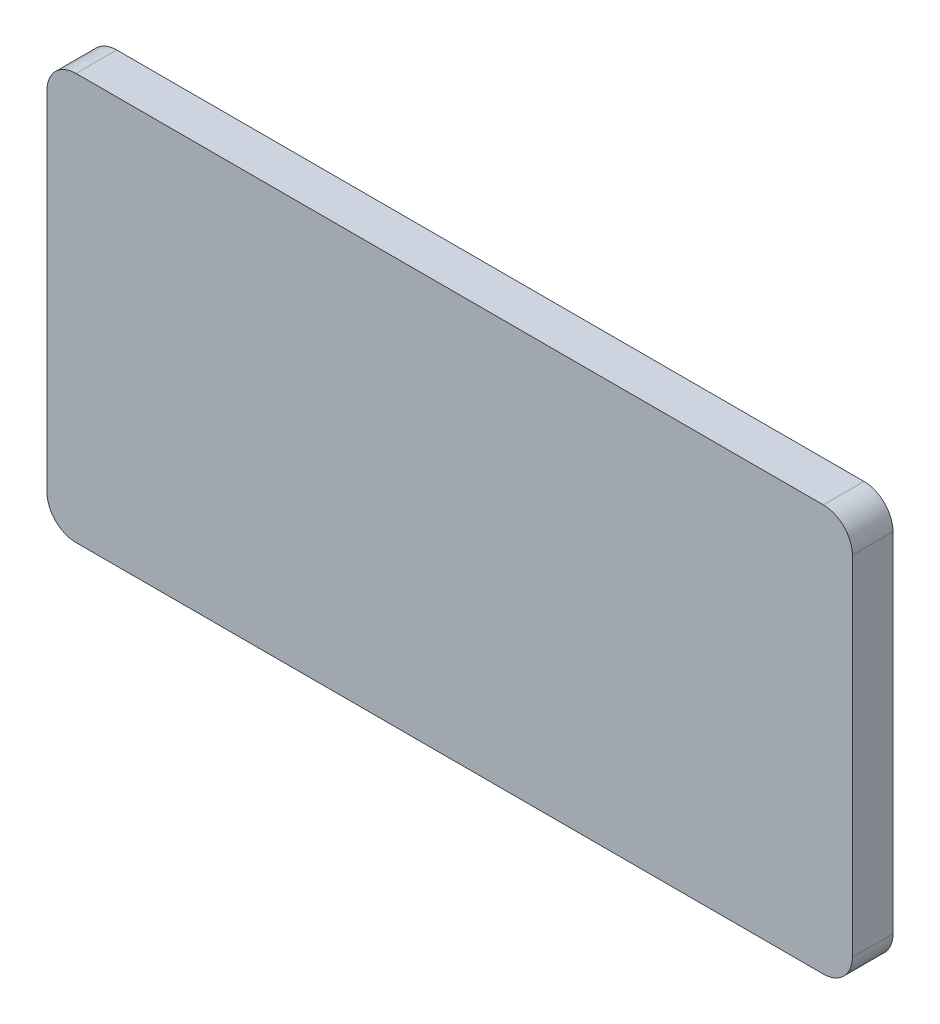
ISO-10303-21;
HEADER;
FILE_DESCRIPTION(('STEP AP214'),'2;1');
FILE_NAME('part.step','',(''),(''),'','','');
FILE_SCHEMA(('AUTOMOTIVE_DESIGN { 1 0 10303 214 1 1 1 1 }'));
ENDSEC;
DATA;
#1=APPLICATION_CONTEXT('core data for automotive mechanical design processes');
#2=APPLICATION_PROTOCOL_DEFINITION('international standard','automotive_design',2000,#1);
#3=PRODUCT_CONTEXT('',#1,'mechanical');
#4=PRODUCT('Part','Part','',(#3));
#5=PRODUCT_RELATED_PRODUCT_CATEGORY('part','',(#4));
#6=PRODUCT_DEFINITION_FORMATION('','',#4);
#7=PRODUCT_DEFINITION_CONTEXT('part definition',#1,'design');
#8=PRODUCT_DEFINITION('design','',#6,#7);
#9=PRODUCT_DEFINITION_SHAPE('','',#8);
#10=(LENGTH_UNIT() NAMED_UNIT(*) SI_UNIT(.MILLI.,.METRE.));
#11=(NAMED_UNIT(*) PLANE_ANGLE_UNIT() SI_UNIT($,.RADIAN.));
#12=(NAMED_UNIT(*) SI_UNIT($,.STERADIAN.) SOLID_ANGLE_UNIT());
#13=UNCERTAINTY_MEASURE_WITH_UNIT(LENGTH_MEASURE(1.E-05),#10,'distance_accuracy_value','');
#14=(GEOMETRIC_REPRESENTATION_CONTEXT(3) GLOBAL_UNCERTAINTY_ASSIGNED_CONTEXT((#13)) GLOBAL_UNIT_ASSIGNED_CONTEXT((#10,
#11,#12)) REPRESENTATION_CONTEXT('',''));
#15=CARTESIAN_POINT('',(0.,0.,0.));
#16=DIRECTION('',(0.,0.,1.));
#17=DIRECTION('',(1.,0.,0.));
#18=AXIS2_PLACEMENT_3D('',#15,#16,#17);
#19=CARTESIAN_POINT('',(-65.6231454005935,-30.,7.));
#20=DIRECTION('',(0.,0.,-1.));
#21=DIRECTION('',(-1.,0.,0.));
#22=AXIS2_PLACEMENT_3D('',#19,#20,#21);
#23=CYLINDRICAL_SURFACE('',#22,5.);
#24=CARTESIAN_POINT('',(-65.6231454005935,-30.,0.));
#25=DIRECTION('',(0.,0.,1.));
#26=DIRECTION('',(1.,0.,0.));
#27=AXIS2_PLACEMENT_3D('',#24,#25,#26);
#28=CIRCLE('',#27,5.);
#29=CARTESIAN_POINT('',(-70.6231454005935,-30.,0.));
#30=VERTEX_POINT('',#29);
#31=CARTESIAN_POINT('',(-65.6231454005935,-35.,0.));
#32=VERTEX_POINT('',#31);
#33=EDGE_CURVE('E133',#30,#32,#28,.T.);
#34=ORIENTED_EDGE('',*,*,#33,.T.);
#35=DIRECTION('',(0.,0.,-1.));
#36=VECTOR('',#35,1.);
#37=CARTESIAN_POINT('',(-65.6231454005935,-35.,7.));
#38=LINE('',#37,#36);
#39=CARTESIAN_POINT('',(-65.6231454005935,-35.,7.));
#40=VERTEX_POINT('',#39);
#41=EDGE_CURVE('E11',#40,#32,#38,.T.);
#42=ORIENTED_EDGE('',*,*,#41,.F.);
#43=CARTESIAN_POINT('',(-65.6231454005935,-30.,7.));
#44=DIRECTION('',(0.,0.,1.));
#45=DIRECTION('',(1.,0.,0.));
#46=AXIS2_PLACEMENT_3D('',#43,#44,#45);
#47=CIRCLE('',#46,5.);
#48=CARTESIAN_POINT('',(-70.6231454005935,-30.,7.));
#49=VERTEX_POINT('',#48);
#50=EDGE_CURVE('E147',#49,#40,#47,.T.);
#51=ORIENTED_EDGE('',*,*,#50,.F.);
#52=DIRECTION('',(0.,0.,-1.));
#53=VECTOR('',#52,1.);
#54=CARTESIAN_POINT('',(-70.6231454005935,-30.,7.));
#55=LINE('',#54,#53);
#56=EDGE_CURVE('E129',#49,#30,#55,.T.);
#57=ORIENTED_EDGE('',*,*,#56,.T.);
#58=EDGE_LOOP('',(#34,#42,#51,#57));
#59=FACE_BOUND('',#58,.T.);
#60=ADVANCED_FACE('F37',(#59),#23,.T.);
#61=CARTESIAN_POINT('',(-65.6231454005935,-35.,7.));
#62=DIRECTION('',(0.,1.,0.));
#63=DIRECTION('',(0.,0.,1.));
#64=AXIS2_PLACEMENT_3D('',#61,#62,#63);
#65=PLANE('',#64);
#66=DIRECTION('',(1.,0.,0.));
#67=VECTOR('',#66,1.);
#68=CARTESIAN_POINT('',(-65.6231454005935,-35.,0.));
#69=LINE('',#68,#67);
#70=CARTESIAN_POINT('',(63.1305637982196,-35.,0.));
#71=VERTEX_POINT('',#70);
#72=EDGE_CURVE('E136',#32,#71,#69,.T.);
#73=ORIENTED_EDGE('',*,*,#72,.T.);
#74=DIRECTION('',(0.,0.,-1.));
#75=VECTOR('',#74,1.);
#76=CARTESIAN_POINT('',(63.1305637982196,-35.,7.));
#77=LINE('',#76,#75);
#78=CARTESIAN_POINT('',(63.1305637982196,-35.,7.));
#79=VERTEX_POINT('',#78);
#80=EDGE_CURVE('E45',#79,#71,#77,.T.);
#81=ORIENTED_EDGE('',*,*,#80,.F.);
#82=DIRECTION('',(1.,0.,0.));
#83=VECTOR('',#82,1.);
#84=CARTESIAN_POINT('',(-65.6231454005935,-35.,7.));
#85=LINE('',#84,#83);
#86=EDGE_CURVE('E96',#40,#79,#85,.T.);
#87=ORIENTED_EDGE('',*,*,#86,.F.);
#88=ORIENTED_EDGE('',*,*,#41,.T.);
#89=EDGE_LOOP('',(#73,#81,#87,#88));
#90=FACE_BOUND('',#89,.T.);
#91=ADVANCED_FACE('F182',(#90),#65,.F.);
#92=CARTESIAN_POINT('',(63.1305637982196,-30.,7.));
#93=DIRECTION('',(0.,0.,-1.));
#94=DIRECTION('',(-1.,0.,0.));
#95=AXIS2_PLACEMENT_3D('',#92,#93,#94);
#96=CYLINDRICAL_SURFACE('',#95,5.);
#97=CARTESIAN_POINT('',(63.1305637982196,-30.,0.));
#98=DIRECTION('',(0.,0.,1.));
#99=DIRECTION('',(1.,0.,0.));
#100=AXIS2_PLACEMENT_3D('',#97,#98,#99);
#101=CIRCLE('',#100,5.);
#102=CARTESIAN_POINT('',(68.1305637982196,-30.,0.));
#103=VERTEX_POINT('',#102);
#104=EDGE_CURVE('E138',#71,#103,#101,.T.);
#105=ORIENTED_EDGE('',*,*,#104,.T.);
#106=DIRECTION('',(0.,0.,-1.));
#107=VECTOR('',#106,1.);
#108=CARTESIAN_POINT('',(68.1305637982196,-30.,7.));
#109=LINE('',#108,#107);
#110=CARTESIAN_POINT('',(68.1305637982196,-30.,7.));
#111=VERTEX_POINT('',#110);
#112=EDGE_CURVE('E154',#111,#103,#109,.T.);
#113=ORIENTED_EDGE('',*,*,#112,.F.);
#114=CARTESIAN_POINT('',(63.1305637982196,-30.,7.));
#115=DIRECTION('',(0.,0.,1.));
#116=DIRECTION('',(1.,0.,0.));
#117=AXIS2_PLACEMENT_3D('',#114,#115,#116);
#118=CIRCLE('',#117,5.);
#119=EDGE_CURVE('E162',#79,#111,#118,.T.);
#120=ORIENTED_EDGE('',*,*,#119,.F.);
#121=ORIENTED_EDGE('',*,*,#80,.T.);
#122=EDGE_LOOP('',(#105,#113,#120,#121));
#123=FACE_BOUND('',#122,.T.);
#124=ADVANCED_FACE('F160',(#123),#96,.T.);
#125=CARTESIAN_POINT('',(68.1305637982196,30.,7.));
#126=DIRECTION('',(-1.,0.,0.));
#127=DIRECTION('',(0.,0.,1.));
#128=AXIS2_PLACEMENT_3D('',#125,#126,#127);
#129=PLANE('',#128);
#130=DIRECTION('',(0.,1.,0.));
#131=VECTOR('',#130,1.);
#132=CARTESIAN_POINT('',(68.1305637982196,30.,0.));
#133=LINE('',#132,#131);
#134=CARTESIAN_POINT('',(68.1305637982196,30.,0.));
#135=VERTEX_POINT('',#134);
#136=EDGE_CURVE('E140',#103,#135,#133,.T.);
#137=ORIENTED_EDGE('',*,*,#136,.T.);
#138=DIRECTION('',(0.,0.,-1.));
#139=VECTOR('',#138,1.);
#140=CARTESIAN_POINT('',(68.1305637982196,30.,7.));
#141=LINE('',#140,#139);
#142=CARTESIAN_POINT('',(68.1305637982196,30.,7.));
#143=VERTEX_POINT('',#142);
#144=EDGE_CURVE('E151',#143,#135,#141,.T.);
#145=ORIENTED_EDGE('',*,*,#144,.F.);
#146=DIRECTION('',(0.,1.,0.));
#147=VECTOR('',#146,1.);
#148=CARTESIAN_POINT('',(68.1305637982196,30.,7.));
#149=LINE('',#148,#147);
#150=EDGE_CURVE('E174',#111,#143,#149,.T.);
#151=ORIENTED_EDGE('',*,*,#150,.F.);
#152=ORIENTED_EDGE('',*,*,#112,.T.);
#153=EDGE_LOOP('',(#137,#145,#151,#152));
#154=FACE_BOUND('',#153,.T.);
#155=ADVANCED_FACE('F170',(#154),#129,.F.);
#156=CARTESIAN_POINT('',(63.1305637982196,30.,7.));
#157=DIRECTION('',(0.,0.,-1.));
#158=DIRECTION('',(-1.,0.,0.));
#159=AXIS2_PLACEMENT_3D('',#156,#157,#158);
#160=CYLINDRICAL_SURFACE('',#159,5.);
#161=CARTESIAN_POINT('',(63.1305637982196,30.,0.));
#162=DIRECTION('',(0.,0.,1.));
#163=DIRECTION('',(-1.,0.,0.));
#164=AXIS2_PLACEMENT_3D('',#161,#162,#163);
#165=CIRCLE('',#164,5.);
#166=CARTESIAN_POINT('',(63.1305637982196,35.,0.));
#167=VERTEX_POINT('',#166);
#168=EDGE_CURVE('E142',#135,#167,#165,.T.);
#169=ORIENTED_EDGE('',*,*,#168,.T.);
#170=DIRECTION('',(0.,0.,-1.));
#171=VECTOR('',#170,1.);
#172=CARTESIAN_POINT('',(63.1305637982196,35.,7.));
#173=LINE('',#172,#171);
#174=CARTESIAN_POINT('',(63.1305637982196,35.,7.));
#175=VERTEX_POINT('',#174);
#176=EDGE_CURVE('E124',#175,#167,#173,.T.);
#177=ORIENTED_EDGE('',*,*,#176,.F.);
#178=CARTESIAN_POINT('',(63.1305637982196,30.,7.));
#179=DIRECTION('',(0.,0.,1.));
#180=DIRECTION('',(-1.,0.,0.));
#181=AXIS2_PLACEMENT_3D('',#178,#179,#180);
#182=CIRCLE('',#181,5.);
#183=EDGE_CURVE('E115',#143,#175,#182,.T.);
#184=ORIENTED_EDGE('',*,*,#183,.F.);
#185=ORIENTED_EDGE('',*,*,#144,.T.);
#186=EDGE_LOOP('',(#169,#177,#184,#185));
#187=FACE_BOUND('',#186,.T.);
#188=ADVANCED_FACE('F173',(#187),#160,.T.);
#189=CARTESIAN_POINT('',(-65.6231454005935,35.,7.));
#190=DIRECTION('',(0.,-1.,0.));
#191=DIRECTION('',(0.,0.,-1.));
#192=AXIS2_PLACEMENT_3D('',#189,#190,#191);
#193=PLANE('',#192);
#194=DIRECTION('',(-1.,0.,0.));
#195=VECTOR('',#194,1.);
#196=CARTESIAN_POINT('',(-65.6231454005935,35.,0.));
#197=LINE('',#196,#195);
#198=CARTESIAN_POINT('',(-65.6231454005935,35.,0.));
#199=VERTEX_POINT('',#198);
#200=EDGE_CURVE('E123',#167,#199,#197,.T.);
#201=ORIENTED_EDGE('',*,*,#200,.T.);
#202=DIRECTION('',(0.,0.,-1.));
#203=VECTOR('',#202,1.);
#204=CARTESIAN_POINT('',(-65.6231454005935,35.,7.));
#205=LINE('',#204,#203);
#206=CARTESIAN_POINT('',(-65.6231454005935,35.,7.));
#207=VERTEX_POINT('',#206);
#208=EDGE_CURVE('E120',#207,#199,#205,.T.);
#209=ORIENTED_EDGE('',*,*,#208,.F.);
#210=DIRECTION('',(-1.,0.,0.));
#211=VECTOR('',#210,1.);
#212=CARTESIAN_POINT('',(-65.6231454005935,35.,7.));
#213=LINE('',#212,#211);
#214=EDGE_CURVE('E109',#175,#207,#213,.T.);
#215=ORIENTED_EDGE('',*,*,#214,.F.);
#216=ORIENTED_EDGE('',*,*,#176,.T.);
#217=EDGE_LOOP('',(#201,#209,#215,#216));
#218=FACE_BOUND('',#217,.T.);
#219=ADVANCED_FACE('F121',(#218),#193,.F.);
#220=CARTESIAN_POINT('',(-65.6231454005935,30.,7.));
#221=DIRECTION('',(0.,0.,-1.));
#222=DIRECTION('',(-1.,0.,0.));
#223=AXIS2_PLACEMENT_3D('',#220,#221,#222);
#224=CYLINDRICAL_SURFACE('',#223,5.);
#225=CARTESIAN_POINT('',(-65.6231454005935,30.,0.));
#226=DIRECTION('',(0.,0.,1.));
#227=DIRECTION('',(1.,0.,0.));
#228=AXIS2_PLACEMENT_3D('',#225,#226,#227);
#229=CIRCLE('',#228,5.);
#230=CARTESIAN_POINT('',(-70.6231454005935,30.,0.));
#231=VERTEX_POINT('',#230);
#232=EDGE_CURVE('E82',#199,#231,#229,.T.);
#233=ORIENTED_EDGE('',*,*,#232,.T.);
#234=DIRECTION('',(0.,0.,-1.));
#235=VECTOR('',#234,1.);
#236=CARTESIAN_POINT('',(-70.6231454005935,30.,7.));
#237=LINE('',#236,#235);
#238=CARTESIAN_POINT('',(-70.6231454005935,30.,7.));
#239=VERTEX_POINT('',#238);
#240=EDGE_CURVE('E125',#239,#231,#237,.T.);
#241=ORIENTED_EDGE('',*,*,#240,.F.);
#242=CARTESIAN_POINT('',(-65.6231454005935,30.,7.));
#243=DIRECTION('',(0.,0.,1.));
#244=DIRECTION('',(1.,0.,0.));
#245=AXIS2_PLACEMENT_3D('',#242,#243,#244);
#246=CIRCLE('',#245,5.);
#247=EDGE_CURVE('E113',#207,#239,#246,.T.);
#248=ORIENTED_EDGE('',*,*,#247,.F.);
#249=ORIENTED_EDGE('',*,*,#208,.T.);
#250=EDGE_LOOP('',(#233,#241,#248,#249));
#251=FACE_BOUND('',#250,.T.);
#252=ADVANCED_FACE('F127',(#251),#224,.T.);
#253=CARTESIAN_POINT('',(-70.6231454005935,30.,7.));
#254=DIRECTION('',(1.,0.,0.));
#255=DIRECTION('',(0.,0.,-1.));
#256=AXIS2_PLACEMENT_3D('',#253,#254,#255);
#257=PLANE('',#256);
#258=DIRECTION('',(0.,-1.,0.));
#259=VECTOR('',#258,1.);
#260=CARTESIAN_POINT('',(-70.6231454005935,30.,0.));
#261=LINE('',#260,#259);
#262=EDGE_CURVE('E88',#231,#30,#261,.T.);
#263=ORIENTED_EDGE('',*,*,#262,.T.);
#264=ORIENTED_EDGE('',*,*,#56,.F.);
#265=DIRECTION('',(0.,-1.,0.));
#266=VECTOR('',#265,1.);
#267=CARTESIAN_POINT('',(-70.6231454005935,30.,7.));
#268=LINE('',#267,#266);
#269=EDGE_CURVE('E53',#239,#49,#268,.T.);
#270=ORIENTED_EDGE('',*,*,#269,.F.);
#271=ORIENTED_EDGE('',*,*,#240,.T.);
#272=EDGE_LOOP('',(#263,#264,#270,#271));
#273=FACE_BOUND('',#272,.T.);
#274=ADVANCED_FACE('F198',(#273),#257,.F.);
#275=CARTESIAN_POINT('',(-65.6231454005935,-30.,7.));
#276=DIRECTION('',(0.,0.,1.));
#277=DIRECTION('',(1.,0.,0.));
#278=AXIS2_PLACEMENT_3D('',#275,#276,#277);
#279=PLANE('',#278);
#280=ORIENTED_EDGE('',*,*,#50,.T.);
#281=ORIENTED_EDGE('',*,*,#86,.T.);
#282=ORIENTED_EDGE('',*,*,#119,.T.);
#283=ORIENTED_EDGE('',*,*,#150,.T.);
#284=ORIENTED_EDGE('',*,*,#183,.T.);
#285=ORIENTED_EDGE('',*,*,#214,.T.);
#286=ORIENTED_EDGE('',*,*,#247,.T.);
#287=ORIENTED_EDGE('',*,*,#269,.T.);
#288=EDGE_LOOP('',(#280,#281,#282,#283,#284,#285,#286,#287));
#289=FACE_BOUND('',#288,.T.);
#290=ADVANCED_FACE('F111',(#289),#279,.T.);
#291=CARTESIAN_POINT('',(-65.6231454005935,-30.,0.));
#292=DIRECTION('',(0.,0.,1.));
#293=DIRECTION('',(1.,0.,0.));
#294=AXIS2_PLACEMENT_3D('',#291,#292,#293);
#295=PLANE('',#294);
#296=ORIENTED_EDGE('',*,*,#33,.F.);
#297=ORIENTED_EDGE('',*,*,#262,.F.);
#298=ORIENTED_EDGE('',*,*,#232,.F.);
#299=ORIENTED_EDGE('',*,*,#200,.F.);
#300=ORIENTED_EDGE('',*,*,#168,.F.);
#301=ORIENTED_EDGE('',*,*,#136,.F.);
#302=ORIENTED_EDGE('',*,*,#104,.F.);
#303=ORIENTED_EDGE('',*,*,#72,.F.);
#304=EDGE_LOOP('',(#296,#297,#298,#299,#300,#301,#302,#303));
#305=FACE_BOUND('',#304,.T.);
#306=ADVANCED_FACE('F166',(#305),#295,.F.);
#307=CLOSED_SHELL('',(#60,#91,#124,#155,#188,#219,#252,#274,#290,#306));
#308=MANIFOLD_SOLID_BREP('B2',#307);
#309=ADVANCED_BREP_SHAPE_REPRESENTATION('',(#18,#308),#14);
#310=SHAPE_DEFINITION_REPRESENTATION(#9,#309);
ENDSEC;
END-ISO-10303-21;
